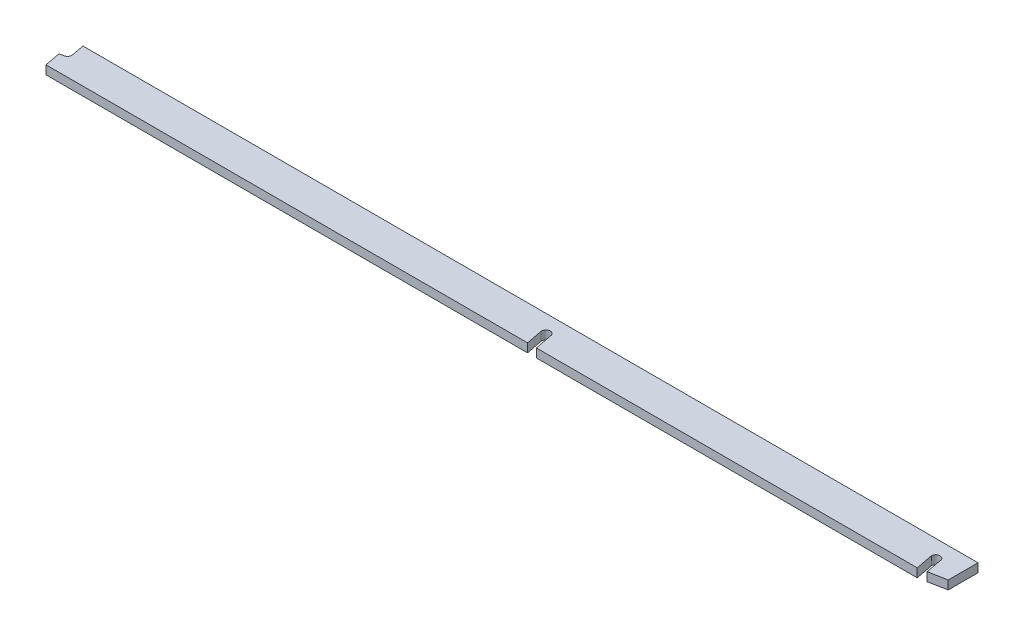
ISO-10303-21;
HEADER;
FILE_DESCRIPTION(('STEP AP214'),'2;1');
FILE_NAME('part.step','',(''),(''),'','','');
FILE_SCHEMA(('AUTOMOTIVE_DESIGN { 1 0 10303 214 1 1 1 1 }'));
ENDSEC;
DATA;
#1=APPLICATION_CONTEXT('core data for automotive mechanical design processes');
#2=APPLICATION_PROTOCOL_DEFINITION('international standard','automotive_design',2000,#1);
#3=PRODUCT_CONTEXT('',#1,'mechanical');
#4=PRODUCT('Part','Part','',(#3));
#5=PRODUCT_RELATED_PRODUCT_CATEGORY('part','',(#4));
#6=PRODUCT_DEFINITION_FORMATION('','',#4);
#7=PRODUCT_DEFINITION_CONTEXT('part definition',#1,'design');
#8=PRODUCT_DEFINITION('design','',#6,#7);
#9=PRODUCT_DEFINITION_SHAPE('','',#8);
#10=(LENGTH_UNIT() NAMED_UNIT(*) SI_UNIT(.MILLI.,.METRE.));
#11=(NAMED_UNIT(*) PLANE_ANGLE_UNIT() SI_UNIT($,.RADIAN.));
#12=(NAMED_UNIT(*) SI_UNIT($,.STERADIAN.) SOLID_ANGLE_UNIT());
#13=UNCERTAINTY_MEASURE_WITH_UNIT(LENGTH_MEASURE(1.E-05),#10,'distance_accuracy_value','');
#14=(GEOMETRIC_REPRESENTATION_CONTEXT(3) GLOBAL_UNCERTAINTY_ASSIGNED_CONTEXT((#13)) GLOBAL_UNIT_ASSIGNED_CONTEXT((#10,
#11,#12)) REPRESENTATION_CONTEXT('',''));
#15=CARTESIAN_POINT('',(0.,0.,0.));
#16=DIRECTION('',(0.,0.,1.));
#17=DIRECTION('',(1.,0.,0.));
#18=AXIS2_PLACEMENT_3D('',#15,#16,#17);
#19=CARTESIAN_POINT('',(-88.9,1.5875,3.175));
#20=DIRECTION('',(0.,0.,-1.));
#21=DIRECTION('',(-1.,0.,0.));
#22=AXIS2_PLACEMENT_3D('',#19,#20,#21);
#23=PLANE('',#22);
#24=DIRECTION('',(1.,0.,0.));
#25=VECTOR('',#24,1.);
#26=CARTESIAN_POINT('',(-88.9,1.5875,3.175));
#27=LINE('',#26,#25);
#28=CARTESIAN_POINT('',(-75.0653139057638,1.5875,3.17500000000001));
#29=VERTEX_POINT('',#28);
#30=CARTESIAN_POINT('',(12.9342148054652,1.5875,3.175));
#31=VERTEX_POINT('',#30);
#32=EDGE_CURVE('E162',#29,#31,#27,.T.);
#33=ORIENTED_EDGE('',*,*,#32,.F.);
#34=DIRECTION('',(0.,1.,0.));
#35=VECTOR('',#34,1.);
#36=CARTESIAN_POINT('',(-75.0653139057638,-0.000999999999999916,3.17500000000001));
#37=LINE('',#36,#35);
#38=CARTESIAN_POINT('',(-75.0653139057638,0.,3.17500000000001));
#39=VERTEX_POINT('',#38);
#40=EDGE_CURVE('E148',#39,#29,#37,.T.);
#41=ORIENTED_EDGE('',*,*,#40,.F.);
#42=DIRECTION('',(1.,0.,0.));
#43=VECTOR('',#42,1.);
#44=CARTESIAN_POINT('',(-88.9,0.,3.175));
#45=LINE('',#44,#43);
#46=CARTESIAN_POINT('',(12.9342148054652,0.,3.175));
#47=VERTEX_POINT('',#46);
#48=EDGE_CURVE('E186',#39,#47,#45,.T.);
#49=ORIENTED_EDGE('',*,*,#48,.T.);
#50=DIRECTION('',(0.,1.,0.));
#51=VECTOR('',#50,1.);
#52=CARTESIAN_POINT('',(12.9342148054652,-0.000999999999999916,3.175));
#53=LINE('',#52,#51);
#54=EDGE_CURVE('E170',#47,#31,#53,.T.);
#55=ORIENTED_EDGE('',*,*,#54,.T.);
#56=EDGE_LOOP('',(#33,#41,#49,#55));
#57=FACE_BOUND('',#56,.T.);
#58=ADVANCED_FACE('F42',(#57),#23,.F.);
#59=CARTESIAN_POINT('',(14.5506646348412,1.5875,3.175));
#60=VERTEX_POINT('',#59);
#61=CARTESIAN_POINT('',(84.1466646348412,1.5875,3.175));
#62=VERTEX_POINT('',#61);
#63=EDGE_CURVE('E173',#60,#62,#27,.T.);
#64=ORIENTED_EDGE('',*,*,#63,.F.);
#65=DIRECTION('',(0.,1.,0.));
#66=VECTOR('',#65,1.);
#67=CARTESIAN_POINT('',(14.5506646348412,-0.000999999999999916,3.175));
#68=LINE('',#67,#66);
#69=CARTESIAN_POINT('',(14.5506646348411,0.,3.175));
#70=VERTEX_POINT('',#69);
#71=EDGE_CURVE('E317',#70,#60,#68,.T.);
#72=ORIENTED_EDGE('',*,*,#71,.F.);
#73=CARTESIAN_POINT('',(84.1466646348412,0.,3.175));
#74=VERTEX_POINT('',#73);
#75=EDGE_CURVE('E190',#70,#74,#45,.T.);
#76=ORIENTED_EDGE('',*,*,#75,.T.);
#77=DIRECTION('',(0.,1.,0.));
#78=VECTOR('',#77,1.);
#79=CARTESIAN_POINT('',(84.1466646348412,-0.000999999999999916,3.175));
#80=LINE('',#79,#78);
#81=EDGE_CURVE('E253',#74,#62,#80,.T.);
#82=ORIENTED_EDGE('',*,*,#81,.T.);
#83=EDGE_LOOP('',(#64,#72,#76,#82));
#84=FACE_BOUND('',#83,.T.);
#85=ADVANCED_FACE('F44',(#84),#23,.F.);
#86=CARTESIAN_POINT('',(88.9,1.5875,-3.17499999999999));
#87=DIRECTION('',(-1.,0.,0.));
#88=DIRECTION('',(0.,0.,1.));
#89=AXIS2_PLACEMENT_3D('',#86,#87,#88);
#90=PLANE('',#89);
#91=DIRECTION('',(0.,0.,-1.));
#92=VECTOR('',#91,1.);
#93=CARTESIAN_POINT('',(88.9,1.5875,-3.17499999999999));
#94=LINE('',#93,#92);
#95=CARTESIAN_POINT('',(88.9,1.5875,2.26309293563591));
#96=VERTEX_POINT('',#95);
#97=CARTESIAN_POINT('',(88.9,1.5875,-3.17499999999999));
#98=VERTEX_POINT('',#97);
#99=EDGE_CURVE('E172',#96,#98,#94,.T.);
#100=ORIENTED_EDGE('',*,*,#99,.F.);
#101=DIRECTION('',(0.,1.,0.));
#102=VECTOR('',#101,1.);
#103=CARTESIAN_POINT('',(88.9,-0.000999999999999916,2.26309293563591));
#104=LINE('',#103,#102);
#105=CARTESIAN_POINT('',(88.9,0.,2.26309293563591));
#106=VERTEX_POINT('',#105);
#107=EDGE_CURVE('E180',#106,#96,#104,.T.);
#108=ORIENTED_EDGE('',*,*,#107,.F.);
#109=DIRECTION('',(0.,0.,-1.));
#110=VECTOR('',#109,1.);
#111=CARTESIAN_POINT('',(88.9,0.,-3.17499999999999));
#112=LINE('',#111,#110);
#113=CARTESIAN_POINT('',(88.9,0.,-3.17499999999999));
#114=VERTEX_POINT('',#113);
#115=EDGE_CURVE('E189',#106,#114,#112,.T.);
#116=ORIENTED_EDGE('',*,*,#115,.T.);
#117=DIRECTION('',(0.,-1.,0.));
#118=VECTOR('',#117,1.);
#119=CARTESIAN_POINT('',(88.9,1.5875,-3.17499999999999));
#120=LINE('',#119,#118);
#121=EDGE_CURVE('E11',#98,#114,#120,.T.);
#122=ORIENTED_EDGE('',*,*,#121,.F.);
#123=EDGE_LOOP('',(#100,#108,#116,#122));
#124=FACE_BOUND('',#123,.T.);
#125=ADVANCED_FACE('F275',(#124),#90,.F.);
#126=CARTESIAN_POINT('',(-88.9,1.5875,-3.17499999999999));
#127=DIRECTION('',(0.,0.,1.));
#128=DIRECTION('',(1.,0.,0.));
#129=AXIS2_PLACEMENT_3D('',#126,#127,#128);
#130=PLANE('',#129);
#131=DIRECTION('',(-1.,0.,0.));
#132=VECTOR('',#131,1.);
#133=CARTESIAN_POINT('',(-88.9,0.,-3.17499999999999));
#134=LINE('',#133,#132);
#135=CARTESIAN_POINT('',(-74.6670844235479,0.,-3.17499999999999));
#136=VERTEX_POINT('',#135);
#137=EDGE_CURVE('E178',#114,#136,#134,.T.);
#138=ORIENTED_EDGE('',*,*,#137,.T.);
#139=DIRECTION('',(0.,1.,0.));
#140=VECTOR('',#139,1.);
#141=CARTESIAN_POINT('',(-74.6670844235479,-0.000999999999999916,-3.17499999999999));
#142=LINE('',#141,#140);
#143=CARTESIAN_POINT('',(-74.6670844235479,1.5875,-3.17499999999999));
#144=VERTEX_POINT('',#143);
#145=EDGE_CURVE('E199',#136,#144,#142,.T.);
#146=ORIENTED_EDGE('',*,*,#145,.T.);
#147=DIRECTION('',(-1.,0.,0.));
#148=VECTOR('',#147,1.);
#149=CARTESIAN_POINT('',(-88.9,1.5875,-3.17499999999999));
#150=LINE('',#149,#148);
#151=EDGE_CURVE('E51',#98,#144,#150,.T.);
#152=ORIENTED_EDGE('',*,*,#151,.F.);
#153=ORIENTED_EDGE('',*,*,#121,.T.);
#154=EDGE_LOOP('',(#138,#146,#152,#153));
#155=FACE_BOUND('',#154,.T.);
#156=ADVANCED_FACE('F197',(#155),#130,.F.);
#157=CARTESIAN_POINT('',(-88.9,1.5875,3.175));
#158=DIRECTION('',(0.,1.,0.));
#159=DIRECTION('',(0.,0.,1.));
#160=AXIS2_PLACEMENT_3D('',#157,#158,#159);
#161=PLANE('',#160);
#162=DIRECTION('',(-0.188409860457954,0.,-0.982090486911575));
#163=VECTOR('',#162,1.);
#164=CARTESIAN_POINT('',(-75.627951764566,1.5875,0.242237949421261));
#165=LINE('',#164,#163);
#166=CARTESIAN_POINT('',(-75.627951764566,1.5875,0.242237949421261));
#167=VERTEX_POINT('',#166);
#168=EDGE_CURVE('E58',#29,#167,#165,.T.);
#169=ORIENTED_EDGE('',*,*,#168,.F.);
#170=ORIENTED_EDGE('',*,*,#32,.T.);
#171=DIRECTION('',(0.188409860457954,0.,0.982090486911575));
#172=VECTOR('',#171,1.);
#173=CARTESIAN_POINT('',(12.9342148054652,1.5875,3.175));
#174=LINE('',#173,#172);
#175=CARTESIAN_POINT('',(12.3565180516181,1.5875,0.163743132159538));
#176=VERTEX_POINT('',#175);
#177=EDGE_CURVE('E314',#176,#31,#174,.T.);
#178=ORIENTED_EDGE('',*,*,#177,.F.);
#179=CARTESIAN_POINT('',(13.1360523943165,1.5875,0.0141929029594063));
#180=DIRECTION('',(0.,1.,0.));
#181=DIRECTION('',(0.,0.,-1.));
#182=AXIS2_PLACEMENT_3D('',#179,#180,#181);
#183=CIRCLE('',#182,0.793750000000006);
#184=CARTESIAN_POINT('',(13.9155867370149,1.5875,-0.135357326240725));
#185=VERTEX_POINT('',#184);
#186=EDGE_CURVE('E310',#185,#176,#183,.T.);
#187=ORIENTED_EDGE('',*,*,#186,.F.);
#188=DIRECTION('',(-0.188409860457954,0.,-0.982090486911575));
#189=VECTOR('',#188,1.);
#190=CARTESIAN_POINT('',(13.9155867370149,1.5875,-0.135357326240725));
#191=LINE('',#190,#189);
#192=EDGE_CURVE('E306',#60,#185,#191,.T.);
#193=ORIENTED_EDGE('',*,*,#192,.F.);
#194=ORIENTED_EDGE('',*,*,#63,.T.);
#195=DIRECTION('',(0.188409860457955,0.,0.982090486911575));
#196=VECTOR('',#195,1.);
#197=CARTESIAN_POINT('',(83.5290141187541,1.5875,-0.0445167206786961));
#198=LINE('',#197,#196);
#199=CARTESIAN_POINT('',(83.5290141187541,1.5875,-0.0445167206786961));
#200=VERTEX_POINT('',#199);
#201=EDGE_CURVE('E249',#200,#62,#198,.T.);
#202=ORIENTED_EDGE('',*,*,#201,.F.);
#203=CARTESIAN_POINT('',(84.322451972587,1.5875,-0.0222583603393372));
#204=DIRECTION('',(0.,1.,0.));
#205=DIRECTION('',(0.,0.,1.));
#206=AXIS2_PLACEMENT_3D('',#203,#204,#205);
#207=CIRCLE('',#206,0.793750000000001);
#208=CARTESIAN_POINT('',(85.11588982642,1.5875,0.));
#209=VERTEX_POINT('',#208);
#210=EDGE_CURVE('E245',#209,#200,#207,.T.);
#211=ORIENTED_EDGE('',*,*,#210,.F.);
#212=DIRECTION('',(-0.188409860457953,0.,-0.982090486911575));
#213=VECTOR('',#212,1.);
#214=CARTESIAN_POINT('',(85.11588982642,1.5875,0.));
#215=LINE('',#214,#213);
#216=CARTESIAN_POINT('',(85.6689718163481,1.5875,2.88295187667092));
#217=VERTEX_POINT('',#216);
#218=EDGE_CURVE('E241',#217,#209,#215,.T.);
#219=ORIENTED_EDGE('',*,*,#218,.F.);
#220=DIRECTION('',(-0.982090486911575,0.,0.188409860457954));
#221=VECTOR('',#220,1.);
#222=CARTESIAN_POINT('',(85.6689718163481,1.5875,2.88295187667092));
#223=LINE('',#222,#221);
#224=EDGE_CURVE('E237',#96,#217,#223,.T.);
#225=ORIENTED_EDGE('',*,*,#224,.F.);
#226=ORIENTED_EDGE('',*,*,#99,.T.);
#227=ORIENTED_EDGE('',*,*,#151,.T.);
#228=DIRECTION('',(-0.188409860457953,0.,-0.982090486911575));
#229=VECTOR('',#228,1.);
#230=CARTESIAN_POINT('',(-74.6670844235479,1.5875,-3.17499999999999));
#231=LINE('',#230,#229);
#232=CARTESIAN_POINT('',(-74.2184334433324,1.5875,-0.836397028041804));
#233=VERTEX_POINT('',#232);
#234=EDGE_CURVE('E277',#233,#144,#231,.T.);
#235=ORIENTED_EDGE('',*,*,#234,.F.);
#236=CARTESIAN_POINT('',(-74.9979677673184,1.5875,-0.686846701303303));
#237=DIRECTION('',(0.,1.,0.));
#238=DIRECTION('',(0.,0.,1.));
#239=AXIS2_PLACEMENT_3D('',#236,#237,#238);
#240=CIRCLE('',#239,0.793750000000005);
#241=CARTESIAN_POINT('',(-74.8484174405799,1.5875,0.0926876226827612));
#242=VERTEX_POINT('',#241);
#243=EDGE_CURVE('E279',#242,#233,#240,.T.);
#244=ORIENTED_EDGE('',*,*,#243,.F.);
#245=DIRECTION('',(0.982090486911575,0.,-0.188409860457953));
#246=VECTOR('',#245,1.);
#247=CARTESIAN_POINT('',(-74.8484174405799,1.5875,0.0926876226827612));
#248=LINE('',#247,#246);
#249=EDGE_CURVE('E165',#167,#242,#248,.T.);
#250=ORIENTED_EDGE('',*,*,#249,.F.);
#251=EDGE_LOOP('',(#169,#170,#178,#187,#193,#194,#202,#211,#219,#225,#226,#227,#235,#244,#250));
#252=FACE_BOUND('',#251,.T.);
#253=ADVANCED_FACE('F160',(#252),#161,.T.);
#254=CARTESIAN_POINT('',(-88.9,0.,3.175));
#255=DIRECTION('',(0.,1.,0.));
#256=DIRECTION('',(0.,0.,1.));
#257=AXIS2_PLACEMENT_3D('',#254,#255,#256);
#258=PLANE('',#257);
#259=ORIENTED_EDGE('',*,*,#48,.F.);
#260=DIRECTION('',(0.188409860457954,0.,0.982090486911575));
#261=VECTOR('',#260,1.);
#262=CARTESIAN_POINT('',(-75.627951764566,0.,0.242237949421261));
#263=LINE('',#262,#261);
#264=CARTESIAN_POINT('',(-75.627951764566,0.,0.242237949421261));
#265=VERTEX_POINT('',#264);
#266=EDGE_CURVE('E151',#265,#39,#263,.T.);
#267=ORIENTED_EDGE('',*,*,#266,.F.);
#268=DIRECTION('',(-0.982090486911575,0.,0.188409860457953));
#269=VECTOR('',#268,1.);
#270=CARTESIAN_POINT('',(-74.8484174405799,0.,0.0926876226827612));
#271=LINE('',#270,#269);
#272=CARTESIAN_POINT('',(-74.8484174405799,0.,0.0926876226827612));
#273=VERTEX_POINT('',#272);
#274=EDGE_CURVE('E285',#273,#265,#271,.T.);
#275=ORIENTED_EDGE('',*,*,#274,.F.);
#276=CARTESIAN_POINT('',(-74.9979677673184,0.,-0.686846701303303));
#277=DIRECTION('',(0.,1.,0.));
#278=DIRECTION('',(0.,0.,1.));
#279=AXIS2_PLACEMENT_3D('',#276,#277,#278);
#280=CIRCLE('',#279,0.793750000000005);
#281=CARTESIAN_POINT('',(-74.2184334433324,0.,-0.836397028041804));
#282=VERTEX_POINT('',#281);
#283=EDGE_CURVE('E211',#282,#273,#280,.F.);
#284=ORIENTED_EDGE('',*,*,#283,.F.);
#285=DIRECTION('',(0.188409860457953,0.,0.982090486911575));
#286=VECTOR('',#285,1.);
#287=CARTESIAN_POINT('',(-74.6670844235479,0.,-3.17499999999999));
#288=LINE('',#287,#286);
#289=EDGE_CURVE('E208',#136,#282,#288,.T.);
#290=ORIENTED_EDGE('',*,*,#289,.F.);
#291=ORIENTED_EDGE('',*,*,#137,.F.);
#292=ORIENTED_EDGE('',*,*,#115,.F.);
#293=DIRECTION('',(0.982090486911575,0.,-0.188409860457954));
#294=VECTOR('',#293,1.);
#295=CARTESIAN_POINT('',(85.6689718163481,0.,2.88295187667092));
#296=LINE('',#295,#294);
#297=CARTESIAN_POINT('',(85.6689718163481,0.,2.88295187667093));
#298=VERTEX_POINT('',#297);
#299=EDGE_CURVE('E214',#298,#106,#296,.T.);
#300=ORIENTED_EDGE('',*,*,#299,.F.);
#301=DIRECTION('',(0.188409860457953,0.,0.982090486911575));
#302=VECTOR('',#301,1.);
#303=CARTESIAN_POINT('',(85.11588982642,0.,0.));
#304=LINE('',#303,#302);
#305=CARTESIAN_POINT('',(85.11588982642,0.,0.));
#306=VERTEX_POINT('',#305);
#307=EDGE_CURVE('E219',#306,#298,#304,.T.);
#308=ORIENTED_EDGE('',*,*,#307,.F.);
#309=CARTESIAN_POINT('',(84.322451972587,0.,-0.0222583603393372));
#310=DIRECTION('',(0.,1.,0.));
#311=DIRECTION('',(0.,0.,1.));
#312=AXIS2_PLACEMENT_3D('',#309,#310,#311);
#313=CIRCLE('',#312,0.793750000000001);
#314=CARTESIAN_POINT('',(83.5290141187541,0.,-0.0445167206786961));
#315=VERTEX_POINT('',#314);
#316=EDGE_CURVE('E229',#315,#306,#313,.F.);
#317=ORIENTED_EDGE('',*,*,#316,.F.);
#318=DIRECTION('',(-0.188409860457955,0.,-0.982090486911575));
#319=VECTOR('',#318,1.);
#320=CARTESIAN_POINT('',(83.5290141187541,0.,-0.0445167206786961));
#321=LINE('',#320,#319);
#322=EDGE_CURVE('E233',#74,#315,#321,.T.);
#323=ORIENTED_EDGE('',*,*,#322,.F.);
#324=ORIENTED_EDGE('',*,*,#75,.F.);
#325=DIRECTION('',(0.188409860457954,0.,0.982090486911575));
#326=VECTOR('',#325,1.);
#327=CARTESIAN_POINT('',(13.9155867370149,0.,-0.135357326240725));
#328=LINE('',#327,#326);
#329=CARTESIAN_POINT('',(13.9155867370149,0.,-0.135357326240725));
#330=VERTEX_POINT('',#329);
#331=EDGE_CURVE('E320',#330,#70,#328,.T.);
#332=ORIENTED_EDGE('',*,*,#331,.F.);
#333=CARTESIAN_POINT('',(13.1360523943165,0.,0.0141929029594063));
#334=DIRECTION('',(0.,1.,0.));
#335=DIRECTION('',(0.,0.,1.));
#336=AXIS2_PLACEMENT_3D('',#333,#334,#335);
#337=CIRCLE('',#336,0.793750000000006);
#338=CARTESIAN_POINT('',(12.3565180516181,0.,0.163743132159538));
#339=VERTEX_POINT('',#338);
#340=EDGE_CURVE('E66',#339,#330,#337,.F.);
#341=ORIENTED_EDGE('',*,*,#340,.F.);
#342=DIRECTION('',(-0.188409860457954,0.,-0.982090486911575));
#343=VECTOR('',#342,1.);
#344=CARTESIAN_POINT('',(12.9342148054652,0.,3.175));
#345=LINE('',#344,#343);
#346=EDGE_CURVE('E299',#47,#339,#345,.T.);
#347=ORIENTED_EDGE('',*,*,#346,.F.);
#348=EDGE_LOOP('',(#259,#267,#275,#284,#290,#291,#292,#300,#308,#317,#323,#324,#332,#341,#347));
#349=FACE_BOUND('',#348,.T.);
#350=ADVANCED_FACE('F204',(#349),#258,.F.);
#351=CARTESIAN_POINT('',(83.5290141187541,-0.000999999999999916,-0.0445167206786961));
#352=DIRECTION('',(-0.982090486911575,0.,0.188409860457955));
#353=DIRECTION('',(0.188409860457955,0.,0.982090486911575));
#354=AXIS2_PLACEMENT_3D('',#351,#352,#353);
#355=PLANE('',#354);
#356=ORIENTED_EDGE('',*,*,#322,.T.);
#357=DIRECTION('',(0.,1.,0.));
#358=VECTOR('',#357,1.);
#359=CARTESIAN_POINT('',(83.5290141187541,-0.000999999999999916,-0.0445167206786961));
#360=LINE('',#359,#358);
#361=EDGE_CURVE('E257',#315,#200,#360,.T.);
#362=ORIENTED_EDGE('',*,*,#361,.T.);
#363=ORIENTED_EDGE('',*,*,#201,.T.);
#364=ORIENTED_EDGE('',*,*,#81,.F.);
#365=EDGE_LOOP('',(#356,#362,#363,#364));
#366=FACE_BOUND('',#365,.T.);
#367=ADVANCED_FACE('F347',(#366),#355,.F.);
#368=CARTESIAN_POINT('',(84.322451972587,-0.000999999999999916,-0.0222583603393372));
#369=DIRECTION('',(0.,1.,0.));
#370=DIRECTION('',(0.,0.,1.));
#371=AXIS2_PLACEMENT_3D('',#368,#369,#370);
#372=CYLINDRICAL_SURFACE('',#371,0.793750000000001);
#373=ORIENTED_EDGE('',*,*,#316,.T.);
#374=DIRECTION('',(0.,1.,0.));
#375=VECTOR('',#374,1.);
#376=CARTESIAN_POINT('',(85.11588982642,-0.000999999999999916,0.));
#377=LINE('',#376,#375);
#378=EDGE_CURVE('E260',#306,#209,#377,.T.);
#379=ORIENTED_EDGE('',*,*,#378,.T.);
#380=ORIENTED_EDGE('',*,*,#210,.T.);
#381=ORIENTED_EDGE('',*,*,#361,.F.);
#382=EDGE_LOOP('',(#373,#379,#380,#381));
#383=FACE_BOUND('',#382,.T.);
#384=ADVANCED_FACE('F385',(#383),#372,.F.);
#385=CARTESIAN_POINT('',(85.11588982642,-0.000999999999999916,0.));
#386=DIRECTION('',(0.982090486911575,0.,-0.188409860457953));
#387=DIRECTION('',(-0.188409860457953,0.,-0.982090486911575));
#388=AXIS2_PLACEMENT_3D('',#385,#386,#387);
#389=PLANE('',#388);
#390=ORIENTED_EDGE('',*,*,#307,.T.);
#391=DIRECTION('',(0.,1.,0.));
#392=VECTOR('',#391,1.);
#393=CARTESIAN_POINT('',(85.6689718163481,-0.000999999999999916,2.88295187667092));
#394=LINE('',#393,#392);
#395=EDGE_CURVE('E262',#298,#217,#394,.T.);
#396=ORIENTED_EDGE('',*,*,#395,.T.);
#397=ORIENTED_EDGE('',*,*,#218,.T.);
#398=ORIENTED_EDGE('',*,*,#378,.F.);
#399=EDGE_LOOP('',(#390,#396,#397,#398));
#400=FACE_BOUND('',#399,.T.);
#401=ADVANCED_FACE('F382',(#400),#389,.F.);
#402=CARTESIAN_POINT('',(85.6689718163481,-0.000999999999999916,2.88295187667092));
#403=DIRECTION('',(-0.188409860457954,0.,-0.982090486911575));
#404=DIRECTION('',(-0.982090486911575,0.,0.188409860457954));
#405=AXIS2_PLACEMENT_3D('',#402,#403,#404);
#406=PLANE('',#405);
#407=ORIENTED_EDGE('',*,*,#299,.T.);
#408=ORIENTED_EDGE('',*,*,#107,.T.);
#409=ORIENTED_EDGE('',*,*,#224,.T.);
#410=ORIENTED_EDGE('',*,*,#395,.F.);
#411=EDGE_LOOP('',(#407,#408,#409,#410));
#412=FACE_BOUND('',#411,.T.);
#413=ADVANCED_FACE('F270',(#412),#406,.F.);
#414=CARTESIAN_POINT('',(-74.9979677673184,-0.000999999999999916,-0.686846701303303));
#415=DIRECTION('',(0.,1.,0.));
#416=DIRECTION('',(0.,0.,1.));
#417=AXIS2_PLACEMENT_3D('',#414,#415,#416);
#418=CYLINDRICAL_SURFACE('',#417,0.793750000000005);
#419=ORIENTED_EDGE('',*,*,#283,.T.);
#420=DIRECTION('',(0.,1.,0.));
#421=VECTOR('',#420,1.);
#422=CARTESIAN_POINT('',(-74.8484174405799,-0.000999999999999916,0.0926876226827612));
#423=LINE('',#422,#421);
#424=EDGE_CURVE('E215',#273,#242,#423,.T.);
#425=ORIENTED_EDGE('',*,*,#424,.T.);
#426=ORIENTED_EDGE('',*,*,#243,.T.);
#427=DIRECTION('',(0.,1.,0.));
#428=VECTOR('',#427,1.);
#429=CARTESIAN_POINT('',(-74.2184334433324,-0.000999999999999916,-0.836397028041804));
#430=LINE('',#429,#428);
#431=EDGE_CURVE('E224',#282,#233,#430,.T.);
#432=ORIENTED_EDGE('',*,*,#431,.F.);
#433=EDGE_LOOP('',(#419,#425,#426,#432));
#434=FACE_BOUND('',#433,.T.);
#435=ADVANCED_FACE('F292',(#434),#418,.F.);
#436=CARTESIAN_POINT('',(-74.8484174405799,-0.000999999999999916,0.0926876226827612));
#437=DIRECTION('',(0.188409860457953,0.,0.982090486911575));
#438=DIRECTION('',(0.982090486911575,0.,-0.188409860457953));
#439=AXIS2_PLACEMENT_3D('',#436,#437,#438);
#440=PLANE('',#439);
#441=ORIENTED_EDGE('',*,*,#274,.T.);
#442=DIRECTION('',(0.,1.,0.));
#443=VECTOR('',#442,1.);
#444=CARTESIAN_POINT('',(-75.627951764566,-0.000999999999999916,0.242237949421261));
#445=LINE('',#444,#443);
#446=EDGE_CURVE('E156',#265,#167,#445,.T.);
#447=ORIENTED_EDGE('',*,*,#446,.T.);
#448=ORIENTED_EDGE('',*,*,#249,.T.);
#449=ORIENTED_EDGE('',*,*,#424,.F.);
#450=EDGE_LOOP('',(#441,#447,#448,#449));
#451=FACE_BOUND('',#450,.T.);
#452=ADVANCED_FACE('F295',(#451),#440,.F.);
#453=CARTESIAN_POINT('',(-74.6670844235479,-0.000999999999999916,-3.17499999999999));
#454=DIRECTION('',(0.982090486911575,0.,-0.188409860457953));
#455=DIRECTION('',(-0.188409860457953,0.,-0.982090486911575));
#456=AXIS2_PLACEMENT_3D('',#453,#454,#455);
#457=PLANE('',#456);
#458=ORIENTED_EDGE('',*,*,#289,.T.);
#459=ORIENTED_EDGE('',*,*,#431,.T.);
#460=ORIENTED_EDGE('',*,*,#234,.T.);
#461=ORIENTED_EDGE('',*,*,#145,.F.);
#462=EDGE_LOOP('',(#458,#459,#460,#461));
#463=FACE_BOUND('',#462,.T.);
#464=ADVANCED_FACE('F290',(#463),#457,.F.);
#465=CARTESIAN_POINT('',(12.9342148054652,-0.000999999999999916,3.175));
#466=DIRECTION('',(-0.982090486911575,0.,0.188409860457954));
#467=DIRECTION('',(0.188409860457954,0.,0.982090486911575));
#468=AXIS2_PLACEMENT_3D('',#465,#466,#467);
#469=PLANE('',#468);
#470=ORIENTED_EDGE('',*,*,#346,.T.);
#471=DIRECTION('',(0.,1.,0.));
#472=VECTOR('',#471,1.);
#473=CARTESIAN_POINT('',(12.3565180516181,-0.000999999999999916,0.163743132159538));
#474=LINE('',#473,#472);
#475=EDGE_CURVE('E321',#339,#176,#474,.T.);
#476=ORIENTED_EDGE('',*,*,#475,.T.);
#477=ORIENTED_EDGE('',*,*,#177,.T.);
#478=ORIENTED_EDGE('',*,*,#54,.F.);
#479=EDGE_LOOP('',(#470,#476,#477,#478));
#480=FACE_BOUND('',#479,.T.);
#481=ADVANCED_FACE('F353',(#480),#469,.F.);
#482=CARTESIAN_POINT('',(13.1360523943165,-0.000999999999999916,0.0141929029594063));
#483=DIRECTION('',(0.,1.,0.));
#484=DIRECTION('',(0.,0.,1.));
#485=AXIS2_PLACEMENT_3D('',#482,#483,#484);
#486=CYLINDRICAL_SURFACE('',#485,0.793750000000006);
#487=ORIENTED_EDGE('',*,*,#340,.T.);
#488=DIRECTION('',(0.,1.,0.));
#489=VECTOR('',#488,1.);
#490=CARTESIAN_POINT('',(13.9155867370149,-0.000999999999999916,-0.135357326240725));
#491=LINE('',#490,#489);
#492=EDGE_CURVE('E324',#330,#185,#491,.T.);
#493=ORIENTED_EDGE('',*,*,#492,.T.);
#494=ORIENTED_EDGE('',*,*,#186,.T.);
#495=ORIENTED_EDGE('',*,*,#475,.F.);
#496=EDGE_LOOP('',(#487,#493,#494,#495));
#497=FACE_BOUND('',#496,.T.);
#498=ADVANCED_FACE('F350',(#497),#486,.F.);
#499=CARTESIAN_POINT('',(13.9155867370149,-0.000999999999999916,-0.135357326240725));
#500=DIRECTION('',(0.982090486911575,0.,-0.188409860457954));
#501=DIRECTION('',(-0.188409860457954,0.,-0.982090486911575));
#502=AXIS2_PLACEMENT_3D('',#499,#500,#501);
#503=PLANE('',#502);
#504=ORIENTED_EDGE('',*,*,#331,.T.);
#505=ORIENTED_EDGE('',*,*,#71,.T.);
#506=ORIENTED_EDGE('',*,*,#192,.T.);
#507=ORIENTED_EDGE('',*,*,#492,.F.);
#508=EDGE_LOOP('',(#504,#505,#506,#507));
#509=FACE_BOUND('',#508,.T.);
#510=ADVANCED_FACE('F336',(#509),#503,.F.);
#511=CARTESIAN_POINT('',(-75.627951764566,-0.000999999999999916,0.242237949421261));
#512=DIRECTION('',(0.982090486911575,0.,-0.188409860457954));
#513=DIRECTION('',(-0.188409860457954,0.,-0.982090486911575));
#514=AXIS2_PLACEMENT_3D('',#511,#512,#513);
#515=PLANE('',#514);
#516=ORIENTED_EDGE('',*,*,#266,.T.);
#517=ORIENTED_EDGE('',*,*,#40,.T.);
#518=ORIENTED_EDGE('',*,*,#168,.T.);
#519=ORIENTED_EDGE('',*,*,#446,.F.);
#520=EDGE_LOOP('',(#516,#517,#518,#519));
#521=FACE_BOUND('',#520,.T.);
#522=ADVANCED_FACE('F149',(#521),#515,.F.);
#523=CLOSED_SHELL('',(#58,#85,#125,#156,#253,#350,#367,#384,#401,#413,#435,#452,#464,#481,#498,
#510,#522));
#524=MANIFOLD_SOLID_BREP('B2',#523);
#525=ADVANCED_BREP_SHAPE_REPRESENTATION('',(#18,#524),#14);
#526=SHAPE_DEFINITION_REPRESENTATION(#9,#525);
ENDSEC;
END-ISO-10303-21;
